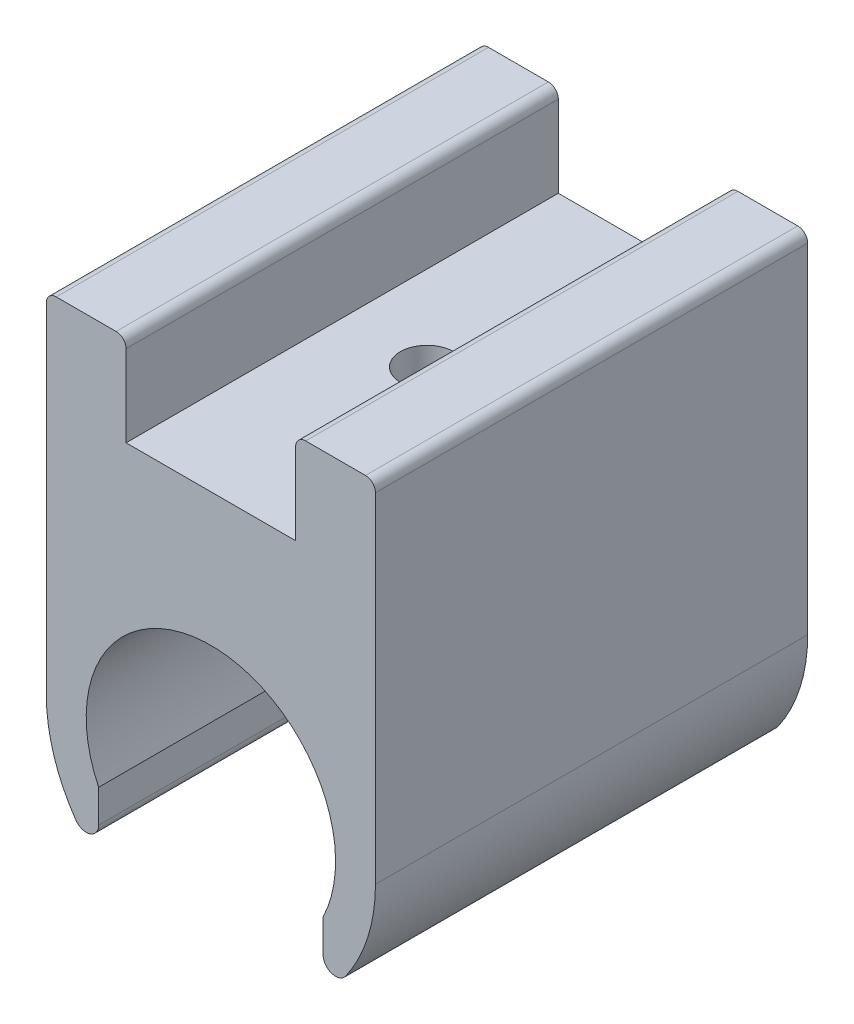
ISO-10303-21;
HEADER;
FILE_DESCRIPTION(('STEP AP214'),'2;1');
FILE_NAME('part.step','',(''),(''),'','','');
FILE_SCHEMA(('AUTOMOTIVE_DESIGN { 1 0 10303 214 1 1 1 1 }'));
ENDSEC;
DATA;
#1=APPLICATION_CONTEXT('core data for automotive mechanical design processes');
#2=APPLICATION_PROTOCOL_DEFINITION('international standard','automotive_design',2000,#1);
#3=PRODUCT_CONTEXT('',#1,'mechanical');
#4=PRODUCT('Part','Part','',(#3));
#5=PRODUCT_RELATED_PRODUCT_CATEGORY('part','',(#4));
#6=PRODUCT_DEFINITION_FORMATION('','',#4);
#7=PRODUCT_DEFINITION_CONTEXT('part definition',#1,'design');
#8=PRODUCT_DEFINITION('design','',#6,#7);
#9=PRODUCT_DEFINITION_SHAPE('','',#8);
#10=(LENGTH_UNIT() NAMED_UNIT(*) SI_UNIT(.MILLI.,.METRE.));
#11=(NAMED_UNIT(*) PLANE_ANGLE_UNIT() SI_UNIT($,.RADIAN.));
#12=(NAMED_UNIT(*) SI_UNIT($,.STERADIAN.) SOLID_ANGLE_UNIT());
#13=UNCERTAINTY_MEASURE_WITH_UNIT(LENGTH_MEASURE(1.E-05),#10,'distance_accuracy_value','');
#14=(GEOMETRIC_REPRESENTATION_CONTEXT(3) GLOBAL_UNCERTAINTY_ASSIGNED_CONTEXT((#13)) GLOBAL_UNIT_ASSIGNED_CONTEXT((#10,
#11,#12)) REPRESENTATION_CONTEXT('',''));
#15=CARTESIAN_POINT('',(0.,0.,0.));
#16=DIRECTION('',(0.,0.,1.));
#17=DIRECTION('',(1.,0.,0.));
#18=AXIS2_PLACEMENT_3D('',#15,#16,#17);
#19=CARTESIAN_POINT('',(9.9,15.5,26.));
#20=DIRECTION('',(0.,-1.,0.));
#21=DIRECTION('',(1.,0.,0.));
#22=AXIS2_PLACEMENT_3D('',#19,#20,#21);
#23=PLANE('',#22);
#24=CARTESIAN_POINT('',(0.,15.5,13.));
#25=DIRECTION('',(0.,1.,0.));
#26=DIRECTION('',(-1.,0.,0.));
#27=AXIS2_PLACEMENT_3D('',#24,#25,#26);
#28=CIRCLE('',#27,1.6);
#29=CARTESIAN_POINT('',(-1.6,15.5,13.));
#30=VERTEX_POINT('',#29);
#31=EDGE_CURVE('E233',#30,#30,#28,.T.);
#32=ORIENTED_EDGE('',*,*,#31,.F.);
#33=EDGE_LOOP('',(#32));
#34=FACE_BOUND('',#33,.T.);
#35=DIRECTION('',(0.,0.,1.));
#36=VECTOR('',#35,1.);
#37=CARTESIAN_POINT('',(5.1,15.5,26.));
#38=LINE('',#37,#36);
#39=CARTESIAN_POINT('',(5.09999999999999,15.5,0.));
#40=VERTEX_POINT('',#39);
#41=CARTESIAN_POINT('',(5.09999999999999,15.5,26.));
#42=VERTEX_POINT('',#41);
#43=EDGE_CURVE('E236',#40,#42,#38,.T.);
#44=ORIENTED_EDGE('',*,*,#43,.F.);
#45=DIRECTION('',(-1.,0.,0.));
#46=VECTOR('',#45,1.);
#47=CARTESIAN_POINT('',(9.9,15.5,0.));
#48=LINE('',#47,#46);
#49=CARTESIAN_POINT('',(-5.1,15.5,0.));
#50=VERTEX_POINT('',#49);
#51=EDGE_CURVE('E294',#40,#50,#48,.T.);
#52=ORIENTED_EDGE('',*,*,#51,.T.);
#53=DIRECTION('',(0.,0.,-1.));
#54=VECTOR('',#53,1.);
#55=CARTESIAN_POINT('',(-5.1,15.5,0.));
#56=LINE('',#55,#54);
#57=CARTESIAN_POINT('',(-5.1,15.5,26.));
#58=VERTEX_POINT('',#57);
#59=EDGE_CURVE('E248',#58,#50,#56,.T.);
#60=ORIENTED_EDGE('',*,*,#59,.F.);
#61=DIRECTION('',(-1.,0.,0.));
#62=VECTOR('',#61,1.);
#63=CARTESIAN_POINT('',(9.9,15.5,26.));
#64=LINE('',#63,#62);
#65=EDGE_CURVE('E274',#42,#58,#64,.T.);
#66=ORIENTED_EDGE('',*,*,#65,.F.);
#67=EDGE_LOOP('',(#44,#52,#60,#66));
#68=FACE_BOUND('',#67,.T.);
#69=ADVANCED_FACE('F36',(#34,#68),#23,.F.);
#70=CARTESIAN_POINT('',(0.,0.,26.));
#71=DIRECTION('',(0.,0.,-1.));
#72=DIRECTION('',(-1.,0.,0.));
#73=AXIS2_PLACEMENT_3D('',#70,#71,#72);
#74=CYLINDRICAL_SURFACE('',#73,7.5);
#75=CARTESIAN_POINT('',(0.,0.,0.));
#76=DIRECTION('',(0.,0.,-1.));
#77=DIRECTION('',(1.,0.,0.));
#78=AXIS2_PLACEMENT_3D('',#75,#76,#77);
#79=CIRCLE('',#78,7.5);
#80=CARTESIAN_POINT('',(-6.75,-3.26917420765551,0.));
#81=VERTEX_POINT('',#80);
#82=CARTESIAN_POINT('',(6.75,-3.26917420765551,0.));
#83=VERTEX_POINT('',#82);
#84=EDGE_CURVE('E261',#81,#83,#79,.T.);
#85=ORIENTED_EDGE('',*,*,#84,.T.);
#86=DIRECTION('',(0.,0.,-1.));
#87=VECTOR('',#86,1.);
#88=CARTESIAN_POINT('',(6.75,-3.26917420765551,26.));
#89=LINE('',#88,#87);
#90=CARTESIAN_POINT('',(6.75,-3.26917420765551,26.));
#91=VERTEX_POINT('',#90);
#92=EDGE_CURVE('E311',#91,#83,#89,.T.);
#93=ORIENTED_EDGE('',*,*,#92,.F.);
#94=CARTESIAN_POINT('',(0.,0.,26.));
#95=DIRECTION('',(0.,0.,-1.));
#96=DIRECTION('',(1.,0.,0.));
#97=AXIS2_PLACEMENT_3D('',#94,#95,#96);
#98=CIRCLE('',#97,7.5);
#99=CARTESIAN_POINT('',(-6.75,-3.26917420765551,26.));
#100=VERTEX_POINT('',#99);
#101=EDGE_CURVE('E262',#100,#91,#98,.T.);
#102=ORIENTED_EDGE('',*,*,#101,.F.);
#103=DIRECTION('',(0.,0.,-1.));
#104=VECTOR('',#103,1.);
#105=CARTESIAN_POINT('',(-6.75,-3.26917420765551,26.));
#106=LINE('',#105,#104);
#107=EDGE_CURVE('E284',#100,#81,#106,.T.);
#108=ORIENTED_EDGE('',*,*,#107,.T.);
#109=EDGE_LOOP('',(#85,#93,#102,#108));
#110=FACE_BOUND('',#109,.T.);
#111=ADVANCED_FACE('F401',(#110),#74,.F.);
#112=CARTESIAN_POINT('',(6.75,-3.26917420765551,26.));
#113=DIRECTION('',(1.,0.,0.));
#114=DIRECTION('',(0.,1.,0.));
#115=AXIS2_PLACEMENT_3D('',#112,#113,#114);
#116=PLANE('',#115);
#117=DIRECTION('',(0.,-1.,0.));
#118=VECTOR('',#117,1.);
#119=CARTESIAN_POINT('',(6.75,-3.26917420765551,0.));
#120=LINE('',#119,#118);
#121=CARTESIAN_POINT('',(6.75,-5.24142156289685,0.));
#122=VERTEX_POINT('',#121);
#123=EDGE_CURVE('E287',#83,#122,#120,.T.);
#124=ORIENTED_EDGE('',*,*,#123,.T.);
#125=DIRECTION('',(0.,0.,-1.));
#126=VECTOR('',#125,1.);
#127=CARTESIAN_POINT('',(6.75,-5.24142156289685,26.));
#128=LINE('',#127,#126);
#129=CARTESIAN_POINT('',(6.75,-5.24142156289685,26.));
#130=VERTEX_POINT('',#129);
#131=EDGE_CURVE('E321',#122,#130,#128,.F.);
#132=ORIENTED_EDGE('',*,*,#131,.T.);
#133=DIRECTION('',(0.,-1.,0.));
#134=VECTOR('',#133,1.);
#135=CARTESIAN_POINT('',(6.75,-3.26917420765551,26.));
#136=LINE('',#135,#134);
#137=EDGE_CURVE('E265',#91,#130,#136,.T.);
#138=ORIENTED_EDGE('',*,*,#137,.F.);
#139=ORIENTED_EDGE('',*,*,#92,.T.);
#140=EDGE_LOOP('',(#124,#132,#138,#139));
#141=FACE_BOUND('',#140,.T.);
#142=ADVANCED_FACE('F395',(#141),#116,.F.);
#143=CARTESIAN_POINT('',(0.,0.,26.));
#144=DIRECTION('',(0.,0.,-1.));
#145=DIRECTION('',(-1.,0.,0.));
#146=AXIS2_PLACEMENT_3D('',#143,#144,#145);
#147=CYLINDRICAL_SURFACE('',#146,9.9);
#148=CARTESIAN_POINT('',(0.,0.,26.));
#149=DIRECTION('',(0.,0.,1.));
#150=DIRECTION('',(1.,0.,0.));
#151=AXIS2_PLACEMENT_3D('',#148,#149,#150);
#152=CIRCLE('',#151,9.9);
#153=CARTESIAN_POINT('',(8.11475409836065,-5.67104628116708,26.));
#154=VERTEX_POINT('',#153);
#155=CARTESIAN_POINT('',(9.9,0.,26.));
#156=VERTEX_POINT('',#155);
#157=EDGE_CURVE('E269',#154,#156,#152,.T.);
#158=ORIENTED_EDGE('',*,*,#157,.F.);
#159=DIRECTION('',(0.,0.,-1.));
#160=VECTOR('',#159,1.);
#161=CARTESIAN_POINT('',(8.11475409836065,-5.67104628116708,26.));
#162=LINE('',#161,#160);
#163=CARTESIAN_POINT('',(8.11475409836065,-5.67104628116708,0.));
#164=VERTEX_POINT('',#163);
#165=EDGE_CURVE('E314',#154,#164,#162,.T.);
#166=ORIENTED_EDGE('',*,*,#165,.T.);
#167=CARTESIAN_POINT('',(0.,0.,0.));
#168=DIRECTION('',(0.,0.,1.));
#169=DIRECTION('',(1.,0.,0.));
#170=AXIS2_PLACEMENT_3D('',#167,#168,#169);
#171=CIRCLE('',#170,9.9);
#172=CARTESIAN_POINT('',(9.9,0.,0.));
#173=VERTEX_POINT('',#172);
#174=EDGE_CURVE('E290',#164,#173,#171,.T.);
#175=ORIENTED_EDGE('',*,*,#174,.T.);
#176=DIRECTION('',(0.,0.,-1.));
#177=VECTOR('',#176,1.);
#178=CARTESIAN_POINT('',(9.9,0.,26.));
#179=LINE('',#178,#177);
#180=EDGE_CURVE('E308',#156,#173,#179,.T.);
#181=ORIENTED_EDGE('',*,*,#180,.F.);
#182=EDGE_LOOP('',(#158,#166,#175,#181));
#183=FACE_BOUND('',#182,.T.);
#184=ADVANCED_FACE('F388',(#183),#147,.T.);
#185=CARTESIAN_POINT('',(9.9,0.,26.));
#186=DIRECTION('',(-1.,0.,0.));
#187=DIRECTION('',(0.,-1.,0.));
#188=AXIS2_PLACEMENT_3D('',#185,#186,#187);
#189=PLANE('',#188);
#190=DIRECTION('',(0.,1.,0.));
#191=VECTOR('',#190,1.);
#192=CARTESIAN_POINT('',(9.9,0.,0.));
#193=LINE('',#192,#191);
#194=CARTESIAN_POINT('',(9.9,20.4,0.));
#195=VERTEX_POINT('',#194);
#196=EDGE_CURVE('E292',#173,#195,#193,.T.);
#197=ORIENTED_EDGE('',*,*,#196,.T.);
#198=DIRECTION('',(0.,0.,-1.));
#199=VECTOR('',#198,1.);
#200=CARTESIAN_POINT('',(9.9,20.4,26.));
#201=LINE('',#200,#199);
#202=CARTESIAN_POINT('',(9.9,20.4,26.));
#203=VERTEX_POINT('',#202);
#204=EDGE_CURVE('E11',#195,#203,#201,.F.);
#205=ORIENTED_EDGE('',*,*,#204,.T.);
#206=DIRECTION('',(0.,1.,0.));
#207=VECTOR('',#206,1.);
#208=CARTESIAN_POINT('',(9.9,0.,26.));
#209=LINE('',#208,#207);
#210=EDGE_CURVE('E271',#156,#203,#209,.T.);
#211=ORIENTED_EDGE('',*,*,#210,.F.);
#212=ORIENTED_EDGE('',*,*,#180,.T.);
#213=EDGE_LOOP('',(#197,#205,#211,#212));
#214=FACE_BOUND('',#213,.T.);
#215=ADVANCED_FACE('F383',(#214),#189,.F.);
#216=CARTESIAN_POINT('',(-9.9,15.5,26.));
#217=DIRECTION('',(1.,0.,0.));
#218=DIRECTION('',(0.,1.,0.));
#219=AXIS2_PLACEMENT_3D('',#216,#217,#218);
#220=PLANE('',#219);
#221=DIRECTION('',(0.,-1.,0.));
#222=VECTOR('',#221,1.);
#223=CARTESIAN_POINT('',(-9.9,15.5,26.));
#224=LINE('',#223,#222);
#225=CARTESIAN_POINT('',(-9.9,20.4,26.));
#226=VERTEX_POINT('',#225);
#227=CARTESIAN_POINT('',(-9.9,0.,26.));
#228=VERTEX_POINT('',#227);
#229=EDGE_CURVE('E277',#226,#228,#224,.T.);
#230=ORIENTED_EDGE('',*,*,#229,.F.);
#231=DIRECTION('',(0.,0.,1.));
#232=VECTOR('',#231,1.);
#233=CARTESIAN_POINT('',(-9.9,20.4,26.));
#234=LINE('',#233,#232);
#235=CARTESIAN_POINT('',(-9.9,20.4,0.));
#236=VERTEX_POINT('',#235);
#237=EDGE_CURVE('E346',#226,#236,#234,.F.);
#238=ORIENTED_EDGE('',*,*,#237,.T.);
#239=DIRECTION('',(0.,-1.,0.));
#240=VECTOR('',#239,1.);
#241=CARTESIAN_POINT('',(-9.9,15.5,0.));
#242=LINE('',#241,#240);
#243=CARTESIAN_POINT('',(-9.9,0.,0.));
#244=VERTEX_POINT('',#243);
#245=EDGE_CURVE('E297',#236,#244,#242,.T.);
#246=ORIENTED_EDGE('',*,*,#245,.T.);
#247=DIRECTION('',(0.,0.,-1.));
#248=VECTOR('',#247,1.);
#249=CARTESIAN_POINT('',(-9.9,0.,26.));
#250=LINE('',#249,#248);
#251=EDGE_CURVE('E305',#228,#244,#250,.T.);
#252=ORIENTED_EDGE('',*,*,#251,.F.);
#253=EDGE_LOOP('',(#230,#238,#246,#252));
#254=FACE_BOUND('',#253,.T.);
#255=ADVANCED_FACE('F419',(#254),#220,.F.);
#256=CARTESIAN_POINT('',(0.,0.,26.));
#257=DIRECTION('',(0.,0.,-1.));
#258=DIRECTION('',(-1.,0.,0.));
#259=AXIS2_PLACEMENT_3D('',#256,#257,#258);
#260=CYLINDRICAL_SURFACE('',#259,9.9);
#261=CARTESIAN_POINT('',(0.,0.,0.));
#262=DIRECTION('',(0.,0.,1.));
#263=DIRECTION('',(1.,0.,0.));
#264=AXIS2_PLACEMENT_3D('',#261,#262,#263);
#265=CIRCLE('',#264,9.9);
#266=CARTESIAN_POINT('',(-8.11475409836065,-5.67104628116708,0.));
#267=VERTEX_POINT('',#266);
#268=EDGE_CURVE('E299',#244,#267,#265,.T.);
#269=ORIENTED_EDGE('',*,*,#268,.T.);
#270=DIRECTION('',(0.,0.,-1.));
#271=VECTOR('',#270,1.);
#272=CARTESIAN_POINT('',(-8.11475409836065,-5.67104628116708,26.));
#273=LINE('',#272,#271);
#274=CARTESIAN_POINT('',(-8.11475409836065,-5.67104628116708,26.));
#275=VERTEX_POINT('',#274);
#276=EDGE_CURVE('E330',#267,#275,#273,.F.);
#277=ORIENTED_EDGE('',*,*,#276,.T.);
#278=CARTESIAN_POINT('',(0.,0.,26.));
#279=DIRECTION('',(0.,0.,1.));
#280=DIRECTION('',(1.,0.,0.));
#281=AXIS2_PLACEMENT_3D('',#278,#279,#280);
#282=CIRCLE('',#281,9.9);
#283=EDGE_CURVE('E279',#228,#275,#282,.T.);
#284=ORIENTED_EDGE('',*,*,#283,.F.);
#285=ORIENTED_EDGE('',*,*,#251,.T.);
#286=EDGE_LOOP('',(#269,#277,#284,#285));
#287=FACE_BOUND('',#286,.T.);
#288=ADVANCED_FACE('F414',(#287),#260,.T.);
#289=CARTESIAN_POINT('',(-6.75,-3.26917420765551,26.));
#290=DIRECTION('',(-1.,0.,0.));
#291=DIRECTION('',(0.,0.,1.));
#292=AXIS2_PLACEMENT_3D('',#289,#290,#291);
#293=PLANE('',#292);
#294=DIRECTION('',(0.,1.,0.));
#295=VECTOR('',#294,1.);
#296=CARTESIAN_POINT('',(-6.75,-3.26917420765551,26.));
#297=LINE('',#296,#295);
#298=CARTESIAN_POINT('',(-6.75,-5.24142156289685,26.));
#299=VERTEX_POINT('',#298);
#300=EDGE_CURVE('E282',#299,#100,#297,.T.);
#301=ORIENTED_EDGE('',*,*,#300,.F.);
#302=DIRECTION('',(0.,0.,-1.));
#303=VECTOR('',#302,1.);
#304=CARTESIAN_POINT('',(-6.75,-5.24142156289685,26.));
#305=LINE('',#304,#303);
#306=CARTESIAN_POINT('',(-6.75,-5.24142156289685,0.));
#307=VERTEX_POINT('',#306);
#308=EDGE_CURVE('E327',#299,#307,#305,.T.);
#309=ORIENTED_EDGE('',*,*,#308,.T.);
#310=DIRECTION('',(0.,1.,0.));
#311=VECTOR('',#310,1.);
#312=CARTESIAN_POINT('',(-6.75,-3.26917420765551,0.));
#313=LINE('',#312,#311);
#314=EDGE_CURVE('E266',#307,#81,#313,.T.);
#315=ORIENTED_EDGE('',*,*,#314,.T.);
#316=ORIENTED_EDGE('',*,*,#107,.F.);
#317=EDGE_LOOP('',(#301,#309,#315,#316));
#318=FACE_BOUND('',#317,.T.);
#319=ADVANCED_FACE('F406',(#318),#293,.F.);
#320=CARTESIAN_POINT('',(0.,0.,26.));
#321=DIRECTION('',(0.,0.,1.));
#322=DIRECTION('',(1.,0.,0.));
#323=AXIS2_PLACEMENT_3D('',#320,#321,#322);
#324=PLANE('',#323);
#325=DIRECTION('',(1.,0.,0.));
#326=VECTOR('',#325,1.);
#327=CARTESIAN_POINT('',(-5.1,21.,26.));
#328=LINE('',#327,#326);
#329=CARTESIAN_POINT('',(-9.3,21.,26.));
#330=VERTEX_POINT('',#329);
#331=CARTESIAN_POINT('',(-5.7,21.,26.));
#332=VERTEX_POINT('',#331);
#333=EDGE_CURVE('E249',#330,#332,#328,.T.);
#334=ORIENTED_EDGE('',*,*,#333,.F.);
#335=CARTESIAN_POINT('',(-9.3,20.4,26.));
#336=DIRECTION('',(0.,0.,1.));
#337=DIRECTION('',(1.,0.,0.));
#338=AXIS2_PLACEMENT_3D('',#335,#336,#337);
#339=CIRCLE('',#338,0.6);
#340=EDGE_CURVE('E344',#330,#226,#339,.T.);
#341=ORIENTED_EDGE('',*,*,#340,.T.);
#342=ORIENTED_EDGE('',*,*,#229,.T.);
#343=ORIENTED_EDGE('',*,*,#283,.T.);
#344=CARTESIAN_POINT('',(-7.5,-5.24142156289685,26.));
#345=DIRECTION('',(0.,0.,1.));
#346=DIRECTION('',(1.,0.,0.));
#347=AXIS2_PLACEMENT_3D('',#344,#345,#346);
#348=CIRCLE('',#347,0.75);
#349=EDGE_CURVE('E323',#275,#299,#348,.T.);
#350=ORIENTED_EDGE('',*,*,#349,.T.);
#351=ORIENTED_EDGE('',*,*,#300,.T.);
#352=ORIENTED_EDGE('',*,*,#101,.T.);
#353=ORIENTED_EDGE('',*,*,#137,.T.);
#354=CARTESIAN_POINT('',(7.5,-5.24142156289685,26.));
#355=DIRECTION('',(0.,0.,1.));
#356=DIRECTION('',(1.,0.,0.));
#357=AXIS2_PLACEMENT_3D('',#354,#355,#356);
#358=CIRCLE('',#357,0.75);
#359=EDGE_CURVE('E325',#130,#154,#358,.T.);
#360=ORIENTED_EDGE('',*,*,#359,.T.);
#361=ORIENTED_EDGE('',*,*,#157,.T.);
#362=ORIENTED_EDGE('',*,*,#210,.T.);
#363=CARTESIAN_POINT('',(9.3,20.4,26.));
#364=DIRECTION('',(0.,0.,1.));
#365=DIRECTION('',(1.,0.,0.));
#366=AXIS2_PLACEMENT_3D('',#363,#364,#365);
#367=CIRCLE('',#366,0.6);
#368=CARTESIAN_POINT('',(9.3,21.,26.));
#369=VERTEX_POINT('',#368);
#370=EDGE_CURVE('E338',#203,#369,#367,.T.);
#371=ORIENTED_EDGE('',*,*,#370,.T.);
#372=DIRECTION('',(1.,0.,0.));
#373=VECTOR('',#372,1.);
#374=CARTESIAN_POINT('',(9.9,21.,26.));
#375=LINE('',#374,#373);
#376=CARTESIAN_POINT('',(5.69999999999999,21.,26.));
#377=VERTEX_POINT('',#376);
#378=EDGE_CURVE('E239',#377,#369,#375,.T.);
#379=ORIENTED_EDGE('',*,*,#378,.F.);
#380=CARTESIAN_POINT('',(5.69999999999999,20.4,26.));
#381=DIRECTION('',(0.,0.,1.));
#382=DIRECTION('',(1.,0.,0.));
#383=AXIS2_PLACEMENT_3D('',#380,#381,#382);
#384=CIRCLE('',#383,0.6);
#385=CARTESIAN_POINT('',(5.09999999999999,20.4,26.));
#386=VERTEX_POINT('',#385);
#387=EDGE_CURVE('E340',#377,#386,#384,.T.);
#388=ORIENTED_EDGE('',*,*,#387,.T.);
#389=DIRECTION('',(0.,-1.,0.));
#390=VECTOR('',#389,1.);
#391=CARTESIAN_POINT('',(5.09999999999999,21.,26.));
#392=LINE('',#391,#390);
#393=EDGE_CURVE('E242',#386,#42,#392,.T.);
#394=ORIENTED_EDGE('',*,*,#393,.T.);
#395=ORIENTED_EDGE('',*,*,#65,.T.);
#396=DIRECTION('',(0.,-1.,0.));
#397=VECTOR('',#396,1.);
#398=CARTESIAN_POINT('',(-5.1,21.,26.));
#399=LINE('',#398,#397);
#400=CARTESIAN_POINT('',(-5.1,20.4,26.));
#401=VERTEX_POINT('',#400);
#402=EDGE_CURVE('E259',#401,#58,#399,.T.);
#403=ORIENTED_EDGE('',*,*,#402,.F.);
#404=CARTESIAN_POINT('',(-5.7,20.4,26.));
#405=DIRECTION('',(0.,0.,1.));
#406=DIRECTION('',(1.,0.,0.));
#407=AXIS2_PLACEMENT_3D('',#404,#405,#406);
#408=CIRCLE('',#407,0.6);
#409=EDGE_CURVE('E342',#401,#332,#408,.T.);
#410=ORIENTED_EDGE('',*,*,#409,.T.);
#411=EDGE_LOOP('',(#334,#341,#342,#343,#350,#351,#352,#353,#360,#361,#362,#371,#379,#388,#394,
#395,#403,#410));
#412=FACE_BOUND('',#411,.T.);
#413=ADVANCED_FACE('F377',(#412),#324,.T.);
#414=CARTESIAN_POINT('',(0.,0.,0.));
#415=DIRECTION('',(0.,0.,1.));
#416=DIRECTION('',(1.,0.,0.));
#417=AXIS2_PLACEMENT_3D('',#414,#415,#416);
#418=PLANE('',#417);
#419=DIRECTION('',(0.,1.,0.));
#420=VECTOR('',#419,1.);
#421=CARTESIAN_POINT('',(-3.,10.6,0.));
#422=LINE('',#421,#420);
#423=CARTESIAN_POINT('',(-3.,10.6,0.));
#424=VERTEX_POINT('',#423);
#425=CARTESIAN_POINT('',(-3.,13.,0.));
#426=VERTEX_POINT('',#425);
#427=EDGE_CURVE('E196',#424,#426,#422,.T.);
#428=ORIENTED_EDGE('',*,*,#427,.F.);
#429=DIRECTION('',(-1.,0.,0.));
#430=VECTOR('',#429,1.);
#431=CARTESIAN_POINT('',(3.,10.6,0.));
#432=LINE('',#431,#430);
#433=CARTESIAN_POINT('',(3.,10.6,0.));
#434=VERTEX_POINT('',#433);
#435=EDGE_CURVE('E203',#434,#424,#432,.T.);
#436=ORIENTED_EDGE('',*,*,#435,.F.);
#437=DIRECTION('',(0.,1.,0.));
#438=VECTOR('',#437,1.);
#439=CARTESIAN_POINT('',(3.,10.6,0.));
#440=LINE('',#439,#438);
#441=CARTESIAN_POINT('',(3.,13.,0.));
#442=VERTEX_POINT('',#441);
#443=EDGE_CURVE('E186',#434,#442,#440,.T.);
#444=ORIENTED_EDGE('',*,*,#443,.T.);
#445=DIRECTION('',(-1.,0.,0.));
#446=VECTOR('',#445,1.);
#447=CARTESIAN_POINT('',(3.,13.,0.));
#448=LINE('',#447,#446);
#449=EDGE_CURVE('E217',#442,#426,#448,.T.);
#450=ORIENTED_EDGE('',*,*,#449,.T.);
#451=EDGE_LOOP('',(#428,#436,#444,#450));
#452=FACE_BOUND('',#451,.T.);
#453=ORIENTED_EDGE('',*,*,#245,.F.);
#454=CARTESIAN_POINT('',(-9.3,20.4,0.));
#455=DIRECTION('',(0.,0.,1.));
#456=DIRECTION('',(1.,0.,0.));
#457=AXIS2_PLACEMENT_3D('',#454,#455,#456);
#458=CIRCLE('',#457,0.6);
#459=CARTESIAN_POINT('',(-9.3,21.,0.));
#460=VERTEX_POINT('',#459);
#461=EDGE_CURVE('E352',#236,#460,#458,.F.);
#462=ORIENTED_EDGE('',*,*,#461,.T.);
#463=DIRECTION('',(-1.,0.,0.));
#464=VECTOR('',#463,1.);
#465=CARTESIAN_POINT('',(-9.90000000000001,21.,0.));
#466=LINE('',#465,#464);
#467=CARTESIAN_POINT('',(-5.7,21.,0.));
#468=VERTEX_POINT('',#467);
#469=EDGE_CURVE('E252',#468,#460,#466,.T.);
#470=ORIENTED_EDGE('',*,*,#469,.F.);
#471=CARTESIAN_POINT('',(-5.7,20.4,0.));
#472=DIRECTION('',(0.,0.,1.));
#473=DIRECTION('',(1.,0.,0.));
#474=AXIS2_PLACEMENT_3D('',#471,#472,#473);
#475=CIRCLE('',#474,0.6);
#476=CARTESIAN_POINT('',(-5.1,20.4,0.));
#477=VERTEX_POINT('',#476);
#478=EDGE_CURVE('E350',#468,#477,#475,.F.);
#479=ORIENTED_EDGE('',*,*,#478,.T.);
#480=DIRECTION('',(0.,-1.,0.));
#481=VECTOR('',#480,1.);
#482=CARTESIAN_POINT('',(-5.1,21.,0.));
#483=LINE('',#482,#481);
#484=EDGE_CURVE('E255',#477,#50,#483,.T.);
#485=ORIENTED_EDGE('',*,*,#484,.T.);
#486=ORIENTED_EDGE('',*,*,#51,.F.);
#487=DIRECTION('',(0.,-1.,0.));
#488=VECTOR('',#487,1.);
#489=CARTESIAN_POINT('',(5.09999999999999,21.,0.));
#490=LINE('',#489,#488);
#491=CARTESIAN_POINT('',(5.09999999999999,20.4,0.));
#492=VERTEX_POINT('',#491);
#493=EDGE_CURVE('E246',#492,#40,#490,.T.);
#494=ORIENTED_EDGE('',*,*,#493,.F.);
#495=CARTESIAN_POINT('',(5.69999999999999,20.4,0.));
#496=DIRECTION('',(0.,0.,1.));
#497=DIRECTION('',(1.,0.,0.));
#498=AXIS2_PLACEMENT_3D('',#495,#496,#497);
#499=CIRCLE('',#498,0.6);
#500=CARTESIAN_POINT('',(5.69999999999999,21.,0.));
#501=VERTEX_POINT('',#500);
#502=EDGE_CURVE('E57',#492,#501,#499,.F.);
#503=ORIENTED_EDGE('',*,*,#502,.T.);
#504=DIRECTION('',(-1.,0.,0.));
#505=VECTOR('',#504,1.);
#506=CARTESIAN_POINT('',(5.09999999999999,21.,0.));
#507=LINE('',#506,#505);
#508=CARTESIAN_POINT('',(9.3,21.,0.));
#509=VERTEX_POINT('',#508);
#510=EDGE_CURVE('E237',#509,#501,#507,.T.);
#511=ORIENTED_EDGE('',*,*,#510,.F.);
#512=CARTESIAN_POINT('',(9.3,20.4,0.));
#513=DIRECTION('',(0.,0.,1.));
#514=DIRECTION('',(1.,0.,0.));
#515=AXIS2_PLACEMENT_3D('',#512,#513,#514);
#516=CIRCLE('',#515,0.6);
#517=EDGE_CURVE('E51',#509,#195,#516,.F.);
#518=ORIENTED_EDGE('',*,*,#517,.T.);
#519=ORIENTED_EDGE('',*,*,#196,.F.);
#520=ORIENTED_EDGE('',*,*,#174,.F.);
#521=CARTESIAN_POINT('',(7.5,-5.24142156289685,0.));
#522=DIRECTION('',(0.,0.,1.));
#523=DIRECTION('',(1.,0.,0.));
#524=AXIS2_PLACEMENT_3D('',#521,#522,#523);
#525=CIRCLE('',#524,0.75);
#526=EDGE_CURVE('E319',#164,#122,#525,.F.);
#527=ORIENTED_EDGE('',*,*,#526,.T.);
#528=ORIENTED_EDGE('',*,*,#123,.F.);
#529=ORIENTED_EDGE('',*,*,#84,.F.);
#530=ORIENTED_EDGE('',*,*,#314,.F.);
#531=CARTESIAN_POINT('',(-7.5,-5.24142156289685,0.));
#532=DIRECTION('',(0.,0.,1.));
#533=DIRECTION('',(1.,0.,0.));
#534=AXIS2_PLACEMENT_3D('',#531,#532,#533);
#535=CIRCLE('',#534,0.75);
#536=EDGE_CURVE('E317',#307,#267,#535,.F.);
#537=ORIENTED_EDGE('',*,*,#536,.T.);
#538=ORIENTED_EDGE('',*,*,#268,.F.);
#539=EDGE_LOOP('',(#453,#462,#470,#479,#485,#486,#494,#503,#511,#518,#519,#520,#527,#528,#529,
#530,#537,#538));
#540=FACE_BOUND('',#539,.T.);
#541=ADVANCED_FACE('F208',(#452,#540),#418,.F.);
#542=CARTESIAN_POINT('',(-5.1,21.,0.));
#543=DIRECTION('',(-1.,0.,0.));
#544=DIRECTION('',(0.,-1.,0.));
#545=AXIS2_PLACEMENT_3D('',#542,#543,#544);
#546=PLANE('',#545);
#547=ORIENTED_EDGE('',*,*,#484,.F.);
#548=DIRECTION('',(0.,0.,-1.));
#549=VECTOR('',#548,1.);
#550=CARTESIAN_POINT('',(-5.1,20.4,0.));
#551=LINE('',#550,#549);
#552=EDGE_CURVE('E354',#477,#401,#551,.F.);
#553=ORIENTED_EDGE('',*,*,#552,.T.);
#554=ORIENTED_EDGE('',*,*,#402,.T.);
#555=ORIENTED_EDGE('',*,*,#59,.T.);
#556=EDGE_LOOP('',(#547,#553,#554,#555));
#557=FACE_BOUND('',#556,.T.);
#558=ADVANCED_FACE('F435',(#557),#546,.F.);
#559=CARTESIAN_POINT('',(0.,21.,0.));
#560=DIRECTION('',(0.,-1.,0.));
#561=DIRECTION('',(0.,0.,-1.));
#562=AXIS2_PLACEMENT_3D('',#559,#560,#561);
#563=PLANE('',#562);
#564=ORIENTED_EDGE('',*,*,#469,.T.);
#565=DIRECTION('',(0.,0.,1.));
#566=VECTOR('',#565,1.);
#567=CARTESIAN_POINT('',(-9.3,21.,0.));
#568=LINE('',#567,#566);
#569=EDGE_CURVE('E335',#460,#330,#568,.T.);
#570=ORIENTED_EDGE('',*,*,#569,.T.);
#571=ORIENTED_EDGE('',*,*,#333,.T.);
#572=DIRECTION('',(0.,0.,-1.));
#573=VECTOR('',#572,1.);
#574=CARTESIAN_POINT('',(-5.7,21.,0.));
#575=LINE('',#574,#573);
#576=EDGE_CURVE('E332',#332,#468,#575,.T.);
#577=ORIENTED_EDGE('',*,*,#576,.T.);
#578=EDGE_LOOP('',(#564,#570,#571,#577));
#579=FACE_BOUND('',#578,.T.);
#580=ADVANCED_FACE('F426',(#579),#563,.F.);
#581=CARTESIAN_POINT('',(5.09999999999999,21.,26.));
#582=DIRECTION('',(1.,0.,0.));
#583=DIRECTION('',(0.,1.,0.));
#584=AXIS2_PLACEMENT_3D('',#581,#582,#583);
#585=PLANE('',#584);
#586=ORIENTED_EDGE('',*,*,#393,.F.);
#587=DIRECTION('',(0.,0.,1.));
#588=VECTOR('',#587,1.);
#589=CARTESIAN_POINT('',(5.09999999999999,20.4,26.));
#590=LINE('',#589,#588);
#591=EDGE_CURVE('E44',#386,#492,#590,.F.);
#592=ORIENTED_EDGE('',*,*,#591,.T.);
#593=ORIENTED_EDGE('',*,*,#493,.T.);
#594=ORIENTED_EDGE('',*,*,#43,.T.);
#595=EDGE_LOOP('',(#586,#592,#593,#594));
#596=FACE_BOUND('',#595,.T.);
#597=ADVANCED_FACE('F364',(#596),#585,.F.);
#598=CARTESIAN_POINT('',(0.,21.,0.));
#599=DIRECTION('',(0.,-1.,0.));
#600=DIRECTION('',(0.,0.,-1.));
#601=AXIS2_PLACEMENT_3D('',#598,#599,#600);
#602=PLANE('',#601);
#603=ORIENTED_EDGE('',*,*,#510,.T.);
#604=DIRECTION('',(0.,0.,1.));
#605=VECTOR('',#604,1.);
#606=CARTESIAN_POINT('',(5.69999999999999,21.,0.));
#607=LINE('',#606,#605);
#608=EDGE_CURVE('E359',#501,#377,#607,.T.);
#609=ORIENTED_EDGE('',*,*,#608,.T.);
#610=ORIENTED_EDGE('',*,*,#378,.T.);
#611=DIRECTION('',(0.,0.,-1.));
#612=VECTOR('',#611,1.);
#613=CARTESIAN_POINT('',(9.3,21.,0.));
#614=LINE('',#613,#612);
#615=EDGE_CURVE('E356',#369,#509,#614,.T.);
#616=ORIENTED_EDGE('',*,*,#615,.T.);
#617=EDGE_LOOP('',(#603,#609,#610,#616));
#618=FACE_BOUND('',#617,.T.);
#619=ADVANCED_FACE('F373',(#618),#602,.F.);
#620=CARTESIAN_POINT('',(7.5,-5.24142156289685,26.));
#621=DIRECTION('',(0.,0.,-1.));
#622=DIRECTION('',(-1.,0.,0.));
#623=AXIS2_PLACEMENT_3D('',#620,#621,#622);
#624=CYLINDRICAL_SURFACE('',#623,0.75);
#625=ORIENTED_EDGE('',*,*,#359,.F.);
#626=ORIENTED_EDGE('',*,*,#131,.F.);
#627=ORIENTED_EDGE('',*,*,#526,.F.);
#628=ORIENTED_EDGE('',*,*,#165,.F.);
#629=EDGE_LOOP('',(#625,#626,#627,#628));
#630=FACE_BOUND('',#629,.T.);
#631=ADVANCED_FACE('F392',(#630),#624,.T.);
#632=CARTESIAN_POINT('',(-7.5,-5.24142156289685,26.));
#633=DIRECTION('',(0.,0.,-1.));
#634=DIRECTION('',(-1.,0.,0.));
#635=AXIS2_PLACEMENT_3D('',#632,#633,#634);
#636=CYLINDRICAL_SURFACE('',#635,0.75);
#637=ORIENTED_EDGE('',*,*,#349,.F.);
#638=ORIENTED_EDGE('',*,*,#276,.F.);
#639=ORIENTED_EDGE('',*,*,#536,.F.);
#640=ORIENTED_EDGE('',*,*,#308,.F.);
#641=EDGE_LOOP('',(#637,#638,#639,#640));
#642=FACE_BOUND('',#641,.T.);
#643=ADVANCED_FACE('F410',(#642),#636,.T.);
#644=CARTESIAN_POINT('',(0.,13.,13.));
#645=DIRECTION('',(0.,1.,0.));
#646=DIRECTION('',(-1.,0.,0.));
#647=AXIS2_PLACEMENT_3D('',#644,#645,#646);
#648=CYLINDRICAL_SURFACE('',#647,1.6);
#649=CARTESIAN_POINT('',(0.,13.,13.));
#650=DIRECTION('',(0.,1.,0.));
#651=DIRECTION('',(-1.,0.,0.));
#652=AXIS2_PLACEMENT_3D('',#649,#650,#651);
#653=CIRCLE('',#652,1.6);
#654=CARTESIAN_POINT('',(-1.6,13.,13.));
#655=VERTEX_POINT('',#654);
#656=EDGE_CURVE('E227',#655,#655,#653,.T.);
#657=ORIENTED_EDGE('',*,*,#656,.F.);
#658=EDGE_LOOP('',(#657));
#659=FACE_BOUND('',#658,.T.);
#660=ORIENTED_EDGE('',*,*,#31,.T.);
#661=EDGE_LOOP('',(#660));
#662=FACE_BOUND('',#661,.T.);
#663=ADVANCED_FACE('F460',(#659,#662),#648,.F.);
#664=CARTESIAN_POINT('',(0.,13.,0.));
#665=DIRECTION('',(0.,-1.,0.));
#666=DIRECTION('',(0.,0.,-1.));
#667=AXIS2_PLACEMENT_3D('',#664,#665,#666);
#668=PLANE('',#667);
#669=DIRECTION('',(0.,0.,-1.));
#670=VECTOR('',#669,1.);
#671=CARTESIAN_POINT('',(3.,13.,0.));
#672=LINE('',#671,#670);
#673=CARTESIAN_POINT('',(3.,13.,16.));
#674=VERTEX_POINT('',#673);
#675=EDGE_CURVE('E192',#674,#442,#672,.T.);
#676=ORIENTED_EDGE('',*,*,#675,.F.);
#677=DIRECTION('',(1.,0.,0.));
#678=VECTOR('',#677,1.);
#679=CARTESIAN_POINT('',(3.,13.,16.));
#680=LINE('',#679,#678);
#681=CARTESIAN_POINT('',(-3.,13.,16.));
#682=VERTEX_POINT('',#681);
#683=EDGE_CURVE('E206',#682,#674,#680,.T.);
#684=ORIENTED_EDGE('',*,*,#683,.F.);
#685=DIRECTION('',(0.,0.,1.));
#686=VECTOR('',#685,1.);
#687=CARTESIAN_POINT('',(-3.,13.,0.));
#688=LINE('',#687,#686);
#689=EDGE_CURVE('E220',#426,#682,#688,.T.);
#690=ORIENTED_EDGE('',*,*,#689,.F.);
#691=ORIENTED_EDGE('',*,*,#449,.F.);
#692=EDGE_LOOP('',(#676,#684,#690,#691));
#693=FACE_BOUND('',#692,.T.);
#694=ORIENTED_EDGE('',*,*,#656,.T.);
#695=EDGE_LOOP('',(#694));
#696=FACE_BOUND('',#695,.T.);
#697=ADVANCED_FACE('F613',(#693,#696),#668,.T.);
#698=CARTESIAN_POINT('',(3.,10.6,0.));
#699=DIRECTION('',(1.,0.,0.));
#700=DIRECTION('',(0.,0.,-1.));
#701=AXIS2_PLACEMENT_3D('',#698,#699,#700);
#702=PLANE('',#701);
#703=ORIENTED_EDGE('',*,*,#675,.T.);
#704=ORIENTED_EDGE('',*,*,#443,.F.);
#705=DIRECTION('',(0.,0.,-1.));
#706=VECTOR('',#705,1.);
#707=CARTESIAN_POINT('',(3.,10.6,0.));
#708=LINE('',#707,#706);
#709=CARTESIAN_POINT('',(3.,10.6,16.));
#710=VERTEX_POINT('',#709);
#711=EDGE_CURVE('E189',#710,#434,#708,.T.);
#712=ORIENTED_EDGE('',*,*,#711,.F.);
#713=DIRECTION('',(0.,1.,0.));
#714=VECTOR('',#713,1.);
#715=CARTESIAN_POINT('',(3.,10.6,16.));
#716=LINE('',#715,#714);
#717=EDGE_CURVE('E225',#710,#674,#716,.T.);
#718=ORIENTED_EDGE('',*,*,#717,.T.);
#719=EDGE_LOOP('',(#703,#704,#712,#718));
#720=FACE_BOUND('',#719,.T.);
#721=ADVANCED_FACE('F188',(#720),#702,.F.);
#722=CARTESIAN_POINT('',(3.,10.6,16.));
#723=DIRECTION('',(0.,0.,1.));
#724=DIRECTION('',(1.,0.,0.));
#725=AXIS2_PLACEMENT_3D('',#722,#723,#724);
#726=PLANE('',#725);
#727=ORIENTED_EDGE('',*,*,#683,.T.);
#728=ORIENTED_EDGE('',*,*,#717,.F.);
#729=DIRECTION('',(1.,0.,0.));
#730=VECTOR('',#729,1.);
#731=CARTESIAN_POINT('',(3.,10.6,16.));
#732=LINE('',#731,#730);
#733=CARTESIAN_POINT('',(-3.,10.6,16.));
#734=VERTEX_POINT('',#733);
#735=EDGE_CURVE('E197',#734,#710,#732,.T.);
#736=ORIENTED_EDGE('',*,*,#735,.F.);
#737=DIRECTION('',(0.,1.,0.));
#738=VECTOR('',#737,1.);
#739=CARTESIAN_POINT('',(-3.,10.6,16.));
#740=LINE('',#739,#738);
#741=EDGE_CURVE('E228',#734,#682,#740,.T.);
#742=ORIENTED_EDGE('',*,*,#741,.T.);
#743=EDGE_LOOP('',(#727,#728,#736,#742));
#744=FACE_BOUND('',#743,.T.);
#745=ADVANCED_FACE('F594',(#744),#726,.F.);
#746=CARTESIAN_POINT('',(-3.,10.6,0.));
#747=DIRECTION('',(-1.,0.,0.));
#748=DIRECTION('',(0.,0.,1.));
#749=AXIS2_PLACEMENT_3D('',#746,#747,#748);
#750=PLANE('',#749);
#751=ORIENTED_EDGE('',*,*,#689,.T.);
#752=ORIENTED_EDGE('',*,*,#741,.F.);
#753=DIRECTION('',(0.,0.,1.));
#754=VECTOR('',#753,1.);
#755=CARTESIAN_POINT('',(-3.,10.6,0.));
#756=LINE('',#755,#754);
#757=EDGE_CURVE('E210',#424,#734,#756,.T.);
#758=ORIENTED_EDGE('',*,*,#757,.F.);
#759=ORIENTED_EDGE('',*,*,#427,.T.);
#760=EDGE_LOOP('',(#751,#752,#758,#759));
#761=FACE_BOUND('',#760,.T.);
#762=ADVANCED_FACE('F584',(#761),#750,.F.);
#763=CARTESIAN_POINT('',(0.,10.6,0.));
#764=DIRECTION('',(0.,-1.,0.));
#765=DIRECTION('',(0.,0.,-1.));
#766=AXIS2_PLACEMENT_3D('',#763,#764,#765);
#767=PLANE('',#766);
#768=CARTESIAN_POINT('',(0.,10.6,13.));
#769=DIRECTION('',(0.,1.,0.));
#770=DIRECTION('',(0.,0.,1.));
#771=AXIS2_PLACEMENT_3D('',#768,#769,#770);
#772=CIRCLE('',#771,1.6);
#773=CARTESIAN_POINT('',(0.,10.6,14.6));
#774=VERTEX_POINT('',#773);
#775=EDGE_CURVE('E700',#774,#774,#772,.T.);
#776=ORIENTED_EDGE('',*,*,#775,.F.);
#777=EDGE_LOOP('',(#776));
#778=FACE_BOUND('',#777,.T.);
#779=ORIENTED_EDGE('',*,*,#711,.T.);
#780=ORIENTED_EDGE('',*,*,#435,.T.);
#781=ORIENTED_EDGE('',*,*,#757,.T.);
#782=ORIENTED_EDGE('',*,*,#735,.T.);
#783=EDGE_LOOP('',(#779,#780,#781,#782));
#784=FACE_BOUND('',#783,.T.);
#785=ADVANCED_FACE('F201',(#778,#784),#767,.F.);
#786=CARTESIAN_POINT('',(0.,8.6,13.));
#787=DIRECTION('',(0.,1.,0.));
#788=DIRECTION('',(0.,0.,1.));
#789=AXIS2_PLACEMENT_3D('',#786,#787,#788);
#790=CYLINDRICAL_SURFACE('',#789,1.6);
#791=CARTESIAN_POINT('',(0.,8.6,13.));
#792=DIRECTION('',(0.,1.,0.));
#793=DIRECTION('',(0.,0.,1.));
#794=AXIS2_PLACEMENT_3D('',#791,#792,#793);
#795=CIRCLE('',#794,1.6);
#796=CARTESIAN_POINT('',(0.,8.6,14.6));
#797=VERTEX_POINT('',#796);
#798=EDGE_CURVE('E218',#797,#797,#795,.T.);
#799=ORIENTED_EDGE('',*,*,#798,.F.);
#800=EDGE_LOOP('',(#799));
#801=FACE_BOUND('',#800,.T.);
#802=ORIENTED_EDGE('',*,*,#775,.T.);
#803=EDGE_LOOP('',(#802));
#804=FACE_BOUND('',#803,.T.);
#805=ADVANCED_FACE('F565',(#801,#804),#790,.F.);
#806=CARTESIAN_POINT('',(0.,8.6,13.));
#807=DIRECTION('',(0.,1.,0.));
#808=DIRECTION('',(0.,0.,1.));
#809=AXIS2_PLACEMENT_3D('',#806,#807,#808);
#810=PLANE('',#809);
#811=ORIENTED_EDGE('',*,*,#798,.T.);
#812=EDGE_LOOP('',(#811));
#813=FACE_BOUND('',#812,.T.);
#814=ADVANCED_FACE('F463',(#813),#810,.T.);
#815=CARTESIAN_POINT('',(-9.3,20.4,0.));
#816=DIRECTION('',(0.,0.,1.));
#817=DIRECTION('',(1.,0.,0.));
#818=AXIS2_PLACEMENT_3D('',#815,#816,#817);
#819=CYLINDRICAL_SURFACE('',#818,0.6);
#820=ORIENTED_EDGE('',*,*,#461,.F.);
#821=ORIENTED_EDGE('',*,*,#237,.F.);
#822=ORIENTED_EDGE('',*,*,#340,.F.);
#823=ORIENTED_EDGE('',*,*,#569,.F.);
#824=EDGE_LOOP('',(#820,#821,#822,#823));
#825=FACE_BOUND('',#824,.T.);
#826=ADVANCED_FACE('F424',(#825),#819,.T.);
#827=CARTESIAN_POINT('',(-5.7,20.4,0.));
#828=DIRECTION('',(0.,0.,-1.));
#829=DIRECTION('',(-1.,0.,0.));
#830=AXIS2_PLACEMENT_3D('',#827,#828,#829);
#831=CYLINDRICAL_SURFACE('',#830,0.6);
#832=ORIENTED_EDGE('',*,*,#409,.F.);
#833=ORIENTED_EDGE('',*,*,#552,.F.);
#834=ORIENTED_EDGE('',*,*,#478,.F.);
#835=ORIENTED_EDGE('',*,*,#576,.F.);
#836=EDGE_LOOP('',(#832,#833,#834,#835));
#837=FACE_BOUND('',#836,.T.);
#838=ADVANCED_FACE('F432',(#837),#831,.T.);
#839=CARTESIAN_POINT('',(5.69999999999999,20.4,0.));
#840=DIRECTION('',(0.,0.,1.));
#841=DIRECTION('',(1.,0.,0.));
#842=AXIS2_PLACEMENT_3D('',#839,#840,#841);
#843=CYLINDRICAL_SURFACE('',#842,0.6);
#844=ORIENTED_EDGE('',*,*,#502,.F.);
#845=ORIENTED_EDGE('',*,*,#591,.F.);
#846=ORIENTED_EDGE('',*,*,#387,.F.);
#847=ORIENTED_EDGE('',*,*,#608,.F.);
#848=EDGE_LOOP('',(#844,#845,#846,#847));
#849=FACE_BOUND('',#848,.T.);
#850=ADVANCED_FACE('F370',(#849),#843,.T.);
#851=CARTESIAN_POINT('',(9.3,20.4,0.));
#852=DIRECTION('',(0.,0.,-1.));
#853=DIRECTION('',(-1.,0.,0.));
#854=AXIS2_PLACEMENT_3D('',#851,#852,#853);
#855=CYLINDRICAL_SURFACE('',#854,0.6);
#856=ORIENTED_EDGE('',*,*,#370,.F.);
#857=ORIENTED_EDGE('',*,*,#204,.F.);
#858=ORIENTED_EDGE('',*,*,#517,.F.);
#859=ORIENTED_EDGE('',*,*,#615,.F.);
#860=EDGE_LOOP('',(#856,#857,#858,#859));
#861=FACE_BOUND('',#860,.T.);
#862=ADVANCED_FACE('F38',(#861),#855,.T.);
#863=CLOSED_SHELL('',(#69,#111,#142,#184,#215,#255,#288,#319,#413,#541,#558,#580,#597,#619,#631,
#643,#663,#697,#721,#745,#762,#785,#805,#814,#826,#838,#850,#862));
#864=MANIFOLD_SOLID_BREP('B2',#863);
#865=ADVANCED_BREP_SHAPE_REPRESENTATION('',(#18,#864),#14);
#866=SHAPE_DEFINITION_REPRESENTATION(#9,#865);
ENDSEC;
END-ISO-10303-21;
